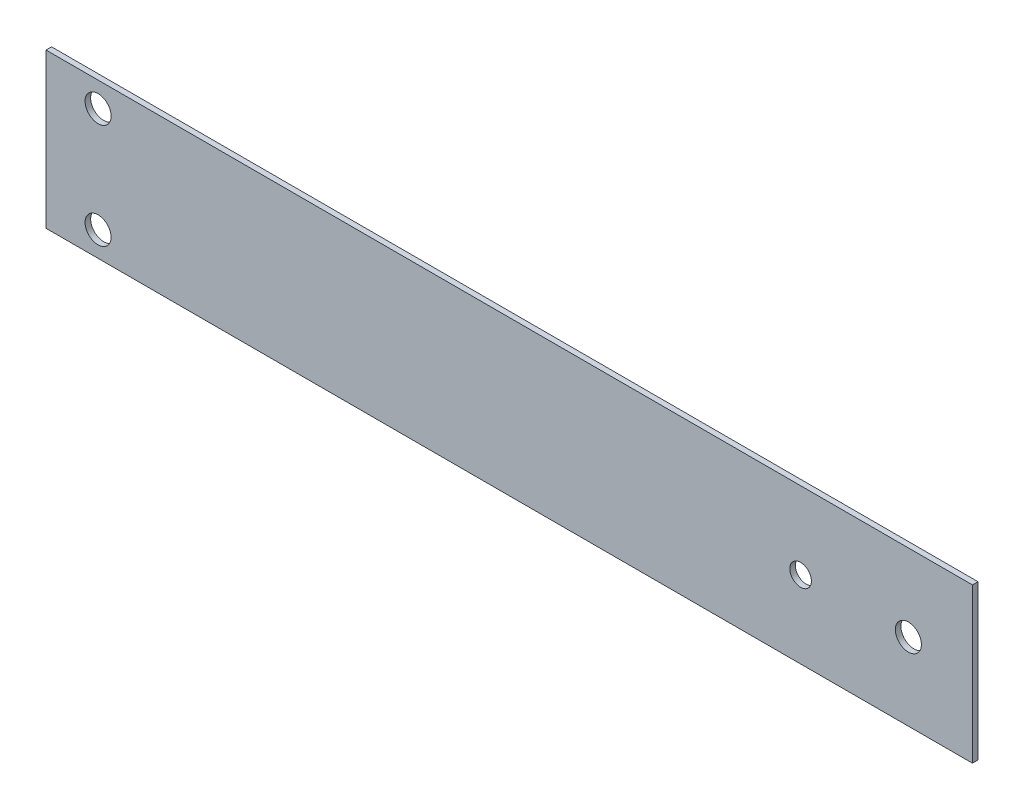
ISO-10303-21;
HEADER;
FILE_DESCRIPTION(('STEP AP214'),'2;1');
FILE_NAME('part.step','',(''),(''),'','','');
FILE_SCHEMA(('AUTOMOTIVE_DESIGN { 1 0 10303 214 1 1 1 1 }'));
ENDSEC;
DATA;
#1=APPLICATION_CONTEXT('core data for automotive mechanical design processes');
#2=APPLICATION_PROTOCOL_DEFINITION('international standard','automotive_design',2000,#1);
#3=PRODUCT_CONTEXT('',#1,'mechanical');
#4=PRODUCT('Part','Part','',(#3));
#5=PRODUCT_RELATED_PRODUCT_CATEGORY('part','',(#4));
#6=PRODUCT_DEFINITION_FORMATION('','',#4);
#7=PRODUCT_DEFINITION_CONTEXT('part definition',#1,'design');
#8=PRODUCT_DEFINITION('design','',#6,#7);
#9=PRODUCT_DEFINITION_SHAPE('','',#8);
#10=(LENGTH_UNIT() NAMED_UNIT(*) SI_UNIT(.MILLI.,.METRE.));
#11=(NAMED_UNIT(*) PLANE_ANGLE_UNIT() SI_UNIT($,.RADIAN.));
#12=(NAMED_UNIT(*) SI_UNIT($,.STERADIAN.) SOLID_ANGLE_UNIT());
#13=UNCERTAINTY_MEASURE_WITH_UNIT(LENGTH_MEASURE(1.E-05),#10,'distance_accuracy_value','');
#14=(GEOMETRIC_REPRESENTATION_CONTEXT(3) GLOBAL_UNCERTAINTY_ASSIGNED_CONTEXT((#13)) GLOBAL_UNIT_ASSIGNED_CONTEXT((#10,
#11,#12)) REPRESENTATION_CONTEXT('',''));
#15=CARTESIAN_POINT('',(0.,0.,0.));
#16=DIRECTION('',(0.,0.,1.));
#17=DIRECTION('',(1.,0.,0.));
#18=AXIS2_PLACEMENT_3D('',#15,#16,#17);
#19=CARTESIAN_POINT('',(-75.,12.5,-0.9));
#20=DIRECTION('',(-1.,0.,0.));
#21=DIRECTION('',(0.,0.,1.));
#22=AXIS2_PLACEMENT_3D('',#19,#20,#21);
#23=PLANE('',#22);
#24=DIRECTION('',(0.,-1.,0.));
#25=VECTOR('',#24,1.);
#26=CARTESIAN_POINT('',(-75.,12.5,0.));
#27=LINE('',#26,#25);
#28=CARTESIAN_POINT('',(-75.,12.5,0.));
#29=VERTEX_POINT('',#28);
#30=CARTESIAN_POINT('',(-75.,-12.5,0.));
#31=VERTEX_POINT('',#30);
#32=EDGE_CURVE('E103',#29,#31,#27,.T.);
#33=ORIENTED_EDGE('',*,*,#32,.F.);
#34=DIRECTION('',(0.,0.,1.));
#35=VECTOR('',#34,1.);
#36=CARTESIAN_POINT('',(-75.,12.5,-0.9));
#37=LINE('',#36,#35);
#38=CARTESIAN_POINT('',(-75.,12.5,-0.9));
#39=VERTEX_POINT('',#38);
#40=EDGE_CURVE('E12',#39,#29,#37,.T.);
#41=ORIENTED_EDGE('',*,*,#40,.F.);
#42=DIRECTION('',(0.,-1.,0.));
#43=VECTOR('',#42,1.);
#44=CARTESIAN_POINT('',(-75.,12.5,-0.9));
#45=LINE('',#44,#43);
#46=CARTESIAN_POINT('',(-75.,-12.5,-0.9));
#47=VERTEX_POINT('',#46);
#48=EDGE_CURVE('E96',#39,#47,#45,.T.);
#49=ORIENTED_EDGE('',*,*,#48,.T.);
#50=DIRECTION('',(0.,0.,1.));
#51=VECTOR('',#50,1.);
#52=CARTESIAN_POINT('',(-75.,-12.5,-0.9));
#53=LINE('',#52,#51);
#54=EDGE_CURVE('E41',#47,#31,#53,.T.);
#55=ORIENTED_EDGE('',*,*,#54,.T.);
#56=EDGE_LOOP('',(#33,#41,#49,#55));
#57=FACE_BOUND('',#56,.T.);
#58=ADVANCED_FACE('F38',(#57),#23,.T.);
#59=CARTESIAN_POINT('',(-75.,12.5,-0.9));
#60=DIRECTION('',(0.,1.,0.));
#61=DIRECTION('',(0.,0.,1.));
#62=AXIS2_PLACEMENT_3D('',#59,#60,#61);
#63=PLANE('',#62);
#64=DIRECTION('',(-1.,0.,0.));
#65=VECTOR('',#64,1.);
#66=CARTESIAN_POINT('',(-75.,12.5,0.));
#67=LINE('',#66,#65);
#68=CARTESIAN_POINT('',(75.,12.5,0.));
#69=VERTEX_POINT('',#68);
#70=EDGE_CURVE('E98',#69,#29,#67,.T.);
#71=ORIENTED_EDGE('',*,*,#70,.F.);
#72=DIRECTION('',(0.,0.,1.));
#73=VECTOR('',#72,1.);
#74=CARTESIAN_POINT('',(75.,12.5,-0.9));
#75=LINE('',#74,#73);
#76=CARTESIAN_POINT('',(75.,12.5,-0.9));
#77=VERTEX_POINT('',#76);
#78=EDGE_CURVE('E47',#77,#69,#75,.T.);
#79=ORIENTED_EDGE('',*,*,#78,.F.);
#80=DIRECTION('',(-1.,0.,0.));
#81=VECTOR('',#80,1.);
#82=CARTESIAN_POINT('',(-75.,12.5,-0.9));
#83=LINE('',#82,#81);
#84=EDGE_CURVE('E93',#77,#39,#83,.T.);
#85=ORIENTED_EDGE('',*,*,#84,.T.);
#86=ORIENTED_EDGE('',*,*,#40,.T.);
#87=EDGE_LOOP('',(#71,#79,#85,#86));
#88=FACE_BOUND('',#87,.T.);
#89=ADVANCED_FACE('F121',(#88),#63,.T.);
#90=CARTESIAN_POINT('',(75.,12.5,-0.9));
#91=DIRECTION('',(1.,0.,0.));
#92=DIRECTION('',(0.,0.,-1.));
#93=AXIS2_PLACEMENT_3D('',#90,#91,#92);
#94=PLANE('',#93);
#95=DIRECTION('',(0.,1.,0.));
#96=VECTOR('',#95,1.);
#97=CARTESIAN_POINT('',(75.,12.5,0.));
#98=LINE('',#97,#96);
#99=CARTESIAN_POINT('',(75.,-12.5,0.));
#100=VERTEX_POINT('',#99);
#101=EDGE_CURVE('E88',#100,#69,#98,.T.);
#102=ORIENTED_EDGE('',*,*,#101,.F.);
#103=DIRECTION('',(0.,0.,1.));
#104=VECTOR('',#103,1.);
#105=CARTESIAN_POINT('',(75.,-12.5,-0.9));
#106=LINE('',#105,#104);
#107=CARTESIAN_POINT('',(75.,-12.5,-0.9));
#108=VERTEX_POINT('',#107);
#109=EDGE_CURVE('E83',#108,#100,#106,.T.);
#110=ORIENTED_EDGE('',*,*,#109,.F.);
#111=DIRECTION('',(0.,1.,0.));
#112=VECTOR('',#111,1.);
#113=CARTESIAN_POINT('',(75.,12.5,-0.9));
#114=LINE('',#113,#112);
#115=EDGE_CURVE('E86',#108,#77,#114,.T.);
#116=ORIENTED_EDGE('',*,*,#115,.T.);
#117=ORIENTED_EDGE('',*,*,#78,.T.);
#118=EDGE_LOOP('',(#102,#110,#116,#117));
#119=FACE_BOUND('',#118,.T.);
#120=ADVANCED_FACE('F85',(#119),#94,.T.);
#121=CARTESIAN_POINT('',(-75.,-12.5,-0.9));
#122=DIRECTION('',(0.,-1.,0.));
#123=DIRECTION('',(0.,0.,-1.));
#124=AXIS2_PLACEMENT_3D('',#121,#122,#123);
#125=PLANE('',#124);
#126=DIRECTION('',(1.,0.,0.));
#127=VECTOR('',#126,1.);
#128=CARTESIAN_POINT('',(-75.,-12.5,0.));
#129=LINE('',#128,#127);
#130=EDGE_CURVE('E107',#31,#100,#129,.T.);
#131=ORIENTED_EDGE('',*,*,#130,.F.);
#132=ORIENTED_EDGE('',*,*,#54,.F.);
#133=DIRECTION('',(1.,0.,0.));
#134=VECTOR('',#133,1.);
#135=CARTESIAN_POINT('',(-75.,-12.5,-0.9));
#136=LINE('',#135,#134);
#137=EDGE_CURVE('E92',#47,#108,#136,.T.);
#138=ORIENTED_EDGE('',*,*,#137,.T.);
#139=ORIENTED_EDGE('',*,*,#109,.T.);
#140=EDGE_LOOP('',(#131,#132,#138,#139));
#141=FACE_BOUND('',#140,.T.);
#142=ADVANCED_FACE('F95',(#141),#125,.T.);
#143=CARTESIAN_POINT('',(0.,0.,-0.9));
#144=DIRECTION('',(0.,0.,1.));
#145=DIRECTION('',(1.,0.,0.));
#146=AXIS2_PLACEMENT_3D('',#143,#144,#145);
#147=PLANE('',#146);
#148=CARTESIAN_POINT('',(47.1780328657471,0.,-0.9));
#149=DIRECTION('',(0.,0.,1.));
#150=DIRECTION('',(1.,0.,0.));
#151=AXIS2_PLACEMENT_3D('',#148,#149,#150);
#152=CIRCLE('',#151,1.75);
#153=CARTESIAN_POINT('',(48.9280328657471,0.,-0.9));
#154=VERTEX_POINT('',#153);
#155=EDGE_CURVE('E162',#154,#154,#152,.T.);
#156=ORIENTED_EDGE('',*,*,#155,.T.);
#157=EDGE_LOOP('',(#156));
#158=FACE_BOUND('',#157,.T.);
#159=CARTESIAN_POINT('',(-66.5679193041697,8.5,-0.9));
#160=DIRECTION('',(0.,0.,1.));
#161=DIRECTION('',(1.,0.,0.));
#162=AXIS2_PLACEMENT_3D('',#159,#160,#161);
#163=CIRCLE('',#162,2.1082);
#164=CARTESIAN_POINT('',(-64.4597193041697,8.5,-0.9));
#165=VERTEX_POINT('',#164);
#166=EDGE_CURVE('E177',#165,#165,#163,.T.);
#167=ORIENTED_EDGE('',*,*,#166,.T.);
#168=EDGE_LOOP('',(#167));
#169=FACE_BOUND('',#168,.T.);
#170=CARTESIAN_POINT('',(-66.5679193041697,-8.5,-0.9));
#171=DIRECTION('',(0.,0.,1.));
#172=DIRECTION('',(1.,0.,0.));
#173=AXIS2_PLACEMENT_3D('',#170,#171,#172);
#174=CIRCLE('',#173,2.1082);
#175=CARTESIAN_POINT('',(-64.4597193041697,-8.5,-0.9));
#176=VERTEX_POINT('',#175);
#177=EDGE_CURVE('E183',#176,#176,#174,.T.);
#178=ORIENTED_EDGE('',*,*,#177,.T.);
#179=EDGE_LOOP('',(#178));
#180=FACE_BOUND('',#179,.T.);
#181=CARTESIAN_POINT('',(64.6280328657471,0.,-0.9));
#182=DIRECTION('',(0.,0.,-1.));
#183=DIRECTION('',(-1.,0.,0.));
#184=AXIS2_PLACEMENT_3D('',#181,#182,#183);
#185=CIRCLE('',#184,2.1082);
#186=CARTESIAN_POINT('',(62.5198328657471,0.,-0.9));
#187=VERTEX_POINT('',#186);
#188=EDGE_CURVE('E186',#187,#187,#185,.T.);
#189=ORIENTED_EDGE('',*,*,#188,.F.);
#190=EDGE_LOOP('',(#189));
#191=FACE_BOUND('',#190,.T.);
#192=ORIENTED_EDGE('',*,*,#48,.F.);
#193=ORIENTED_EDGE('',*,*,#84,.F.);
#194=ORIENTED_EDGE('',*,*,#115,.F.);
#195=ORIENTED_EDGE('',*,*,#137,.F.);
#196=EDGE_LOOP('',(#192,#193,#194,#195));
#197=FACE_BOUND('',#196,.T.);
#198=ADVANCED_FACE('F91',(#158,#169,#180,#191,#197),#147,.F.);
#199=CARTESIAN_POINT('',(0.,0.,0.));
#200=DIRECTION('',(0.,0.,1.));
#201=DIRECTION('',(1.,0.,0.));
#202=AXIS2_PLACEMENT_3D('',#199,#200,#201);
#203=PLANE('',#202);
#204=CARTESIAN_POINT('',(47.1780328657471,0.,0.));
#205=DIRECTION('',(0.,0.,1.));
#206=DIRECTION('',(1.,0.,0.));
#207=AXIS2_PLACEMENT_3D('',#204,#205,#206);
#208=CIRCLE('',#207,1.75);
#209=CARTESIAN_POINT('',(48.9280328657471,0.,0.));
#210=VERTEX_POINT('',#209);
#211=EDGE_CURVE('E165',#210,#210,#208,.T.);
#212=ORIENTED_EDGE('',*,*,#211,.F.);
#213=EDGE_LOOP('',(#212));
#214=FACE_BOUND('',#213,.T.);
#215=CARTESIAN_POINT('',(-66.5679193041697,8.5,0.));
#216=DIRECTION('',(0.,0.,1.));
#217=DIRECTION('',(1.,0.,0.));
#218=AXIS2_PLACEMENT_3D('',#215,#216,#217);
#219=CIRCLE('',#218,2.10819999999999);
#220=CARTESIAN_POINT('',(-64.4597193041697,8.5,0.));
#221=VERTEX_POINT('',#220);
#222=EDGE_CURVE('E167',#221,#221,#219,.T.);
#223=ORIENTED_EDGE('',*,*,#222,.F.);
#224=EDGE_LOOP('',(#223));
#225=FACE_BOUND('',#224,.T.);
#226=CARTESIAN_POINT('',(-66.5679193041697,-8.5,0.));
#227=DIRECTION('',(0.,0.,1.));
#228=DIRECTION('',(1.,0.,0.));
#229=AXIS2_PLACEMENT_3D('',#226,#227,#228);
#230=CIRCLE('',#229,2.10819999999999);
#231=CARTESIAN_POINT('',(-64.4597193041697,-8.5,0.));
#232=VERTEX_POINT('',#231);
#233=EDGE_CURVE('E179',#232,#232,#230,.T.);
#234=ORIENTED_EDGE('',*,*,#233,.F.);
#235=EDGE_LOOP('',(#234));
#236=FACE_BOUND('',#235,.T.);
#237=CARTESIAN_POINT('',(64.6280328657471,0.,0.));
#238=DIRECTION('',(0.,0.,-1.));
#239=DIRECTION('',(-1.,0.,0.));
#240=AXIS2_PLACEMENT_3D('',#237,#238,#239);
#241=CIRCLE('',#240,2.1082);
#242=CARTESIAN_POINT('',(62.5198328657471,0.,0.));
#243=VERTEX_POINT('',#242);
#244=EDGE_CURVE('E108',#243,#243,#241,.T.);
#245=ORIENTED_EDGE('',*,*,#244,.T.);
#246=EDGE_LOOP('',(#245));
#247=FACE_BOUND('',#246,.T.);
#248=ORIENTED_EDGE('',*,*,#32,.T.);
#249=ORIENTED_EDGE('',*,*,#130,.T.);
#250=ORIENTED_EDGE('',*,*,#101,.T.);
#251=ORIENTED_EDGE('',*,*,#70,.T.);
#252=EDGE_LOOP('',(#248,#249,#250,#251));
#253=FACE_BOUND('',#252,.T.);
#254=ADVANCED_FACE('F120',(#214,#225,#236,#247,#253),#203,.T.);
#255=CARTESIAN_POINT('',(64.6280328657471,0.,-0.9));
#256=DIRECTION('',(0.,0.,-1.));
#257=DIRECTION('',(-1.,0.,0.));
#258=AXIS2_PLACEMENT_3D('',#255,#256,#257);
#259=CYLINDRICAL_SURFACE('',#258,2.1082);
#260=ORIENTED_EDGE('',*,*,#244,.F.);
#261=EDGE_LOOP('',(#260));
#262=FACE_BOUND('',#261,.T.);
#263=ORIENTED_EDGE('',*,*,#188,.T.);
#264=EDGE_LOOP('',(#263));
#265=FACE_BOUND('',#264,.T.);
#266=ADVANCED_FACE('F139',(#262,#265),#259,.F.);
#267=CARTESIAN_POINT('',(-66.5679193041697,-8.5,0.));
#268=DIRECTION('',(0.,0.,1.));
#269=DIRECTION('',(1.,0.,0.));
#270=AXIS2_PLACEMENT_3D('',#267,#268,#269);
#271=CYLINDRICAL_SURFACE('',#270,2.1082);
#272=ORIENTED_EDGE('',*,*,#177,.F.);
#273=EDGE_LOOP('',(#272));
#274=FACE_BOUND('',#273,.T.);
#275=ORIENTED_EDGE('',*,*,#233,.T.);
#276=EDGE_LOOP('',(#275));
#277=FACE_BOUND('',#276,.T.);
#278=ADVANCED_FACE('F146',(#274,#277),#271,.F.);
#279=CARTESIAN_POINT('',(-66.5679193041697,8.5,0.));
#280=DIRECTION('',(0.,0.,1.));
#281=DIRECTION('',(1.,0.,0.));
#282=AXIS2_PLACEMENT_3D('',#279,#280,#281);
#283=CYLINDRICAL_SURFACE('',#282,2.1082);
#284=ORIENTED_EDGE('',*,*,#166,.F.);
#285=EDGE_LOOP('',(#284));
#286=FACE_BOUND('',#285,.T.);
#287=ORIENTED_EDGE('',*,*,#222,.T.);
#288=EDGE_LOOP('',(#287));
#289=FACE_BOUND('',#288,.T.);
#290=ADVANCED_FACE('F150',(#286,#289),#283,.F.);
#291=CARTESIAN_POINT('',(47.1780328657471,0.,0.));
#292=DIRECTION('',(0.,0.,1.));
#293=DIRECTION('',(1.,0.,0.));
#294=AXIS2_PLACEMENT_3D('',#291,#292,#293);
#295=CYLINDRICAL_SURFACE('',#294,1.75);
#296=ORIENTED_EDGE('',*,*,#155,.F.);
#297=EDGE_LOOP('',(#296));
#298=FACE_BOUND('',#297,.T.);
#299=ORIENTED_EDGE('',*,*,#211,.T.);
#300=EDGE_LOOP('',(#299));
#301=FACE_BOUND('',#300,.T.);
#302=ADVANCED_FACE('F154',(#298,#301),#295,.F.);
#303=CLOSED_SHELL('',(#58,#89,#120,#142,#198,#254,#266,#278,#290,#302));
#304=MANIFOLD_SOLID_BREP('B2',#303);
#305=ADVANCED_BREP_SHAPE_REPRESENTATION('',(#18,#304),#14);
#306=SHAPE_DEFINITION_REPRESENTATION(#9,#305);
ENDSEC;
END-ISO-10303-21;
